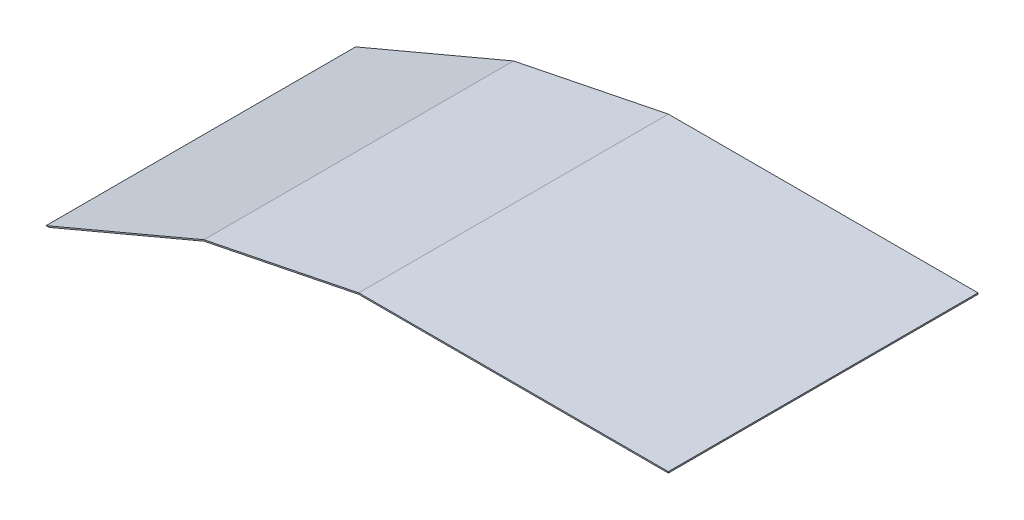
ISO-10303-21;
HEADER;
FILE_DESCRIPTION(('STEP AP214'),'2;1');
FILE_NAME('part.step','',(''),(''),'','','');
FILE_SCHEMA(('AUTOMOTIVE_DESIGN { 1 0 10303 214 1 1 1 1 }'));
ENDSEC;
DATA;
#1=APPLICATION_CONTEXT('core data for automotive mechanical design processes');
#2=APPLICATION_PROTOCOL_DEFINITION('international standard','automotive_design',2000,#1);
#3=PRODUCT_CONTEXT('',#1,'mechanical');
#4=PRODUCT('Part','Part','',(#3));
#5=PRODUCT_RELATED_PRODUCT_CATEGORY('part','',(#4));
#6=PRODUCT_DEFINITION_FORMATION('','',#4);
#7=PRODUCT_DEFINITION_CONTEXT('part definition',#1,'design');
#8=PRODUCT_DEFINITION('design','',#6,#7);
#9=PRODUCT_DEFINITION_SHAPE('','',#8);
#10=(LENGTH_UNIT() NAMED_UNIT(*) SI_UNIT(.MILLI.,.METRE.));
#11=(NAMED_UNIT(*) PLANE_ANGLE_UNIT() SI_UNIT($,.RADIAN.));
#12=(NAMED_UNIT(*) SI_UNIT($,.STERADIAN.) SOLID_ANGLE_UNIT());
#13=UNCERTAINTY_MEASURE_WITH_UNIT(LENGTH_MEASURE(1.E-05),#10,'distance_accuracy_value','');
#14=(GEOMETRIC_REPRESENTATION_CONTEXT(3) GLOBAL_UNCERTAINTY_ASSIGNED_CONTEXT((#13)) GLOBAL_UNIT_ASSIGNED_CONTEXT((#10,
#11,#12)) REPRESENTATION_CONTEXT('',''));
#15=CARTESIAN_POINT('',(0.,0.,0.));
#16=DIRECTION('',(0.,0.,1.));
#17=DIRECTION('',(1.,0.,0.));
#18=AXIS2_PLACEMENT_3D('',#15,#16,#17);
#19=CARTESIAN_POINT('',(-100.,31.6979559310791,100.));
#20=DIRECTION('',(0.,-1.,0.));
#21=DIRECTION('',(1.,0.,0.));
#22=AXIS2_PLACEMENT_3D('',#19,#20,#21);
#23=PLANE('',#22);
#24=DIRECTION('',(-1.,0.,0.));
#25=VECTOR('',#24,1.);
#26=CARTESIAN_POINT('',(-100.,31.6979559310791,0.));
#27=LINE('',#26,#25);
#28=CARTESIAN_POINT('',(0.,31.6979559310791,0.));
#29=VERTEX_POINT('',#28);
#30=CARTESIAN_POINT('',(-100.,31.6979559310791,0.));
#31=VERTEX_POINT('',#30);
#32=EDGE_CURVE('E140',#29,#31,#27,.T.);
#33=ORIENTED_EDGE('',*,*,#32,.T.);
#34=DIRECTION('',(0.,0.,-1.));
#35=VECTOR('',#34,1.);
#36=CARTESIAN_POINT('',(-100.,31.6979559310791,100.));
#37=LINE('',#36,#35);
#38=CARTESIAN_POINT('',(-100.,31.6979559310791,100.));
#39=VERTEX_POINT('',#38);
#40=EDGE_CURVE('E11',#39,#31,#37,.T.);
#41=ORIENTED_EDGE('',*,*,#40,.F.);
#42=DIRECTION('',(-1.,0.,0.));
#43=VECTOR('',#42,1.);
#44=CARTESIAN_POINT('',(-100.,31.6979559310791,100.));
#45=LINE('',#44,#43);
#46=CARTESIAN_POINT('',(0.,31.6979559310791,100.));
#47=VERTEX_POINT('',#46);
#48=EDGE_CURVE('E162',#47,#39,#45,.T.);
#49=ORIENTED_EDGE('',*,*,#48,.F.);
#50=DIRECTION('',(0.,0.,-1.));
#51=VECTOR('',#50,1.);
#52=CARTESIAN_POINT('',(0.,31.6979559310791,100.));
#53=LINE('',#52,#51);
#54=EDGE_CURVE('E136',#47,#29,#53,.T.);
#55=ORIENTED_EDGE('',*,*,#54,.T.);
#56=EDGE_LOOP('',(#33,#41,#49,#55));
#57=FACE_BOUND('',#56,.T.);
#58=ADVANCED_FACE('F39',(#57),#23,.F.);
#59=CARTESIAN_POINT('',(-150.,21.5624541556459,100.));
#60=DIRECTION('',(0.198669330795054,-0.980066577841243,0.));
#61=DIRECTION('',(0.980066577841243,0.198669330795054,0.));
#62=AXIS2_PLACEMENT_3D('',#59,#60,#61);
#63=PLANE('',#62);
#64=DIRECTION('',(-0.980066577841243,-0.198669330795054,0.));
#65=VECTOR('',#64,1.);
#66=CARTESIAN_POINT('',(-150.,21.5624541556459,0.));
#67=LINE('',#66,#65);
#68=CARTESIAN_POINT('',(-150.,21.5624541556459,0.));
#69=VERTEX_POINT('',#68);
#70=EDGE_CURVE('E144',#31,#69,#67,.T.);
#71=ORIENTED_EDGE('',*,*,#70,.T.);
#72=DIRECTION('',(0.,0.,-1.));
#73=VECTOR('',#72,1.);
#74=CARTESIAN_POINT('',(-150.,21.5624541556459,100.));
#75=LINE('',#74,#73);
#76=CARTESIAN_POINT('',(-150.,21.5624541556459,100.));
#77=VERTEX_POINT('',#76);
#78=EDGE_CURVE('E48',#77,#69,#75,.T.);
#79=ORIENTED_EDGE('',*,*,#78,.F.);
#80=DIRECTION('',(-0.980066577841243,-0.198669330795054,0.));
#81=VECTOR('',#80,1.);
#82=CARTESIAN_POINT('',(-150.,21.5624541556459,100.));
#83=LINE('',#82,#81);
#84=EDGE_CURVE('E99',#39,#77,#83,.T.);
#85=ORIENTED_EDGE('',*,*,#84,.F.);
#86=ORIENTED_EDGE('',*,*,#40,.T.);
#87=EDGE_LOOP('',(#71,#79,#85,#86));
#88=FACE_BOUND('',#87,.T.);
#89=ADVANCED_FACE('F208',(#88),#63,.F.);
#90=CARTESIAN_POINT('',(-201.,0.,100.));
#91=DIRECTION('',(0.389418342308644,-0.921060994002888,0.));
#92=DIRECTION('',(0.921060994002888,0.389418342308644,0.));
#93=AXIS2_PLACEMENT_3D('',#90,#91,#92);
#94=PLANE('',#93);
#95=DIRECTION('',(-0.921060994002888,-0.389418342308644,0.));
#96=VECTOR('',#95,1.);
#97=CARTESIAN_POINT('',(-201.,0.,0.));
#98=LINE('',#97,#96);
#99=CARTESIAN_POINT('',(-201.,0.,0.));
#100=VERTEX_POINT('',#99);
#101=EDGE_CURVE('E147',#69,#100,#98,.T.);
#102=ORIENTED_EDGE('',*,*,#101,.T.);
#103=DIRECTION('',(0.,0.,-1.));
#104=VECTOR('',#103,1.);
#105=CARTESIAN_POINT('',(-201.,0.,100.));
#106=LINE('',#105,#104);
#107=CARTESIAN_POINT('',(-201.,0.,100.));
#108=VERTEX_POINT('',#107);
#109=EDGE_CURVE('E173',#108,#100,#106,.T.);
#110=ORIENTED_EDGE('',*,*,#109,.F.);
#111=DIRECTION('',(-0.921060994002888,-0.389418342308644,0.));
#112=VECTOR('',#111,1.);
#113=CARTESIAN_POINT('',(-201.,0.,100.));
#114=LINE('',#113,#112);
#115=EDGE_CURVE('E183',#77,#108,#114,.T.);
#116=ORIENTED_EDGE('',*,*,#115,.F.);
#117=ORIENTED_EDGE('',*,*,#78,.T.);
#118=EDGE_LOOP('',(#102,#110,#116,#117));
#119=FACE_BOUND('',#118,.T.);
#120=ADVANCED_FACE('F181',(#119),#94,.F.);
#121=CARTESIAN_POINT('',(-200.,0.,100.));
#122=DIRECTION('',(0.,1.,0.));
#123=DIRECTION('',(-1.,0.,0.));
#124=AXIS2_PLACEMENT_3D('',#121,#122,#123);
#125=PLANE('',#124);
#126=DIRECTION('',(1.,0.,0.));
#127=VECTOR('',#126,1.);
#128=CARTESIAN_POINT('',(-200.,0.,0.));
#129=LINE('',#128,#127);
#130=CARTESIAN_POINT('',(-200.,0.,0.));
#131=VERTEX_POINT('',#130);
#132=EDGE_CURVE('E150',#100,#131,#129,.T.);
#133=ORIENTED_EDGE('',*,*,#132,.T.);
#134=DIRECTION('',(0.,0.,-1.));
#135=VECTOR('',#134,1.);
#136=CARTESIAN_POINT('',(-200.,0.,100.));
#137=LINE('',#136,#135);
#138=CARTESIAN_POINT('',(-200.,0.,100.));
#139=VERTEX_POINT('',#138);
#140=EDGE_CURVE('E169',#139,#131,#137,.T.);
#141=ORIENTED_EDGE('',*,*,#140,.F.);
#142=DIRECTION('',(1.,0.,0.));
#143=VECTOR('',#142,1.);
#144=CARTESIAN_POINT('',(-200.,0.,100.));
#145=LINE('',#144,#143);
#146=EDGE_CURVE('E196',#108,#139,#145,.T.);
#147=ORIENTED_EDGE('',*,*,#146,.F.);
#148=ORIENTED_EDGE('',*,*,#109,.T.);
#149=EDGE_LOOP('',(#133,#141,#147,#148));
#150=FACE_BOUND('',#149,.T.);
#151=ADVANCED_FACE('F191',(#150),#125,.F.);
#152=CARTESIAN_POINT('',(-200.,0.,100.));
#153=DIRECTION('',(-0.389418342308644,0.921060994002888,0.));
#154=DIRECTION('',(-0.921060994002888,-0.389418342308644,0.));
#155=AXIS2_PLACEMENT_3D('',#152,#153,#154);
#156=PLANE('',#155);
#157=DIRECTION('',(0.921060994002888,0.389418342308644,0.));
#158=VECTOR('',#157,1.);
#159=CARTESIAN_POINT('',(-200.,0.,0.));
#160=LINE('',#159,#158);
#161=CARTESIAN_POINT('',(-150.,21.1396609369077,0.));
#162=VERTEX_POINT('',#161);
#163=EDGE_CURVE('E153',#131,#162,#160,.T.);
#164=ORIENTED_EDGE('',*,*,#163,.T.);
#165=DIRECTION('',(0.,0.,-1.));
#166=VECTOR('',#165,1.);
#167=CARTESIAN_POINT('',(-150.,21.1396609369077,100.));
#168=LINE('',#167,#166);
#169=CARTESIAN_POINT('',(-150.,21.1396609369077,100.));
#170=VERTEX_POINT('',#169);
#171=EDGE_CURVE('E129',#170,#162,#168,.T.);
#172=ORIENTED_EDGE('',*,*,#171,.F.);
#173=DIRECTION('',(0.921060994002888,0.389418342308644,0.));
#174=VECTOR('',#173,1.);
#175=CARTESIAN_POINT('',(-200.,0.,100.));
#176=LINE('',#175,#174);
#177=EDGE_CURVE('E118',#139,#170,#176,.T.);
#178=ORIENTED_EDGE('',*,*,#177,.F.);
#179=ORIENTED_EDGE('',*,*,#140,.T.);
#180=EDGE_LOOP('',(#164,#172,#178,#179));
#181=FACE_BOUND('',#180,.T.);
#182=ADVANCED_FACE('F194',(#181),#156,.F.);
#183=CARTESIAN_POINT('',(-150.,21.1396609369077,100.));
#184=DIRECTION('',(-0.198669330795054,0.980066577841243,0.));
#185=DIRECTION('',(-0.980066577841243,-0.198669330795054,0.));
#186=AXIS2_PLACEMENT_3D('',#183,#184,#185);
#187=PLANE('',#186);
#188=DIRECTION('',(0.980066577841243,0.198669330795054,0.));
#189=VECTOR('',#188,1.);
#190=CARTESIAN_POINT('',(-150.,21.1396609369077,0.));
#191=LINE('',#190,#189);
#192=CARTESIAN_POINT('',(-100.,31.275162712341,0.));
#193=VERTEX_POINT('',#192);
#194=EDGE_CURVE('E127',#162,#193,#191,.T.);
#195=ORIENTED_EDGE('',*,*,#194,.T.);
#196=DIRECTION('',(0.,0.,-1.));
#197=VECTOR('',#196,1.);
#198=CARTESIAN_POINT('',(-100.,31.275162712341,100.));
#199=LINE('',#198,#197);
#200=CARTESIAN_POINT('',(-100.,31.275162712341,100.));
#201=VERTEX_POINT('',#200);
#202=EDGE_CURVE('E124',#201,#193,#199,.T.);
#203=ORIENTED_EDGE('',*,*,#202,.F.);
#204=DIRECTION('',(0.980066577841243,0.198669330795054,0.));
#205=VECTOR('',#204,1.);
#206=CARTESIAN_POINT('',(-150.,21.1396609369077,100.));
#207=LINE('',#206,#205);
#208=EDGE_CURVE('E112',#170,#201,#207,.T.);
#209=ORIENTED_EDGE('',*,*,#208,.F.);
#210=ORIENTED_EDGE('',*,*,#171,.T.);
#211=EDGE_LOOP('',(#195,#203,#209,#210));
#212=FACE_BOUND('',#211,.T.);
#213=ADVANCED_FACE('F125',(#212),#187,.F.);
#214=CARTESIAN_POINT('',(-100.,31.275162712341,100.));
#215=DIRECTION('',(0.,1.,0.));
#216=DIRECTION('',(-1.,0.,0.));
#217=AXIS2_PLACEMENT_3D('',#214,#215,#216);
#218=PLANE('',#217);
#219=DIRECTION('',(1.,0.,0.));
#220=VECTOR('',#219,1.);
#221=CARTESIAN_POINT('',(-100.,31.275162712341,0.));
#222=LINE('',#221,#220);
#223=CARTESIAN_POINT('',(0.,31.275162712341,0.));
#224=VERTEX_POINT('',#223);
#225=EDGE_CURVE('E85',#193,#224,#222,.T.);
#226=ORIENTED_EDGE('',*,*,#225,.T.);
#227=DIRECTION('',(0.,0.,-1.));
#228=VECTOR('',#227,1.);
#229=CARTESIAN_POINT('',(0.,31.275162712341,100.));
#230=LINE('',#229,#228);
#231=CARTESIAN_POINT('',(0.,31.275162712341,100.));
#232=VERTEX_POINT('',#231);
#233=EDGE_CURVE('E130',#232,#224,#230,.T.);
#234=ORIENTED_EDGE('',*,*,#233,.F.);
#235=DIRECTION('',(1.,0.,0.));
#236=VECTOR('',#235,1.);
#237=CARTESIAN_POINT('',(-100.,31.275162712341,100.));
#238=LINE('',#237,#236);
#239=EDGE_CURVE('E116',#201,#232,#238,.T.);
#240=ORIENTED_EDGE('',*,*,#239,.F.);
#241=ORIENTED_EDGE('',*,*,#202,.T.);
#242=EDGE_LOOP('',(#226,#234,#240,#241));
#243=FACE_BOUND('',#242,.T.);
#244=ADVANCED_FACE('F132',(#243),#218,.F.);
#245=CARTESIAN_POINT('',(0.,31.6979559310791,100.));
#246=DIRECTION('',(-1.,0.,0.));
#247=DIRECTION('',(0.,0.,1.));
#248=AXIS2_PLACEMENT_3D('',#245,#246,#247);
#249=PLANE('',#248);
#250=DIRECTION('',(0.,1.,0.));
#251=VECTOR('',#250,1.);
#252=CARTESIAN_POINT('',(0.,31.6979559310791,0.));
#253=LINE('',#252,#251);
#254=EDGE_CURVE('E91',#224,#29,#253,.T.);
#255=ORIENTED_EDGE('',*,*,#254,.T.);
#256=ORIENTED_EDGE('',*,*,#54,.F.);
#257=DIRECTION('',(0.,1.,0.));
#258=VECTOR('',#257,1.);
#259=CARTESIAN_POINT('',(0.,31.6979559310791,100.));
#260=LINE('',#259,#258);
#261=EDGE_CURVE('E56',#232,#47,#260,.T.);
#262=ORIENTED_EDGE('',*,*,#261,.F.);
#263=ORIENTED_EDGE('',*,*,#233,.T.);
#264=EDGE_LOOP('',(#255,#256,#262,#263));
#265=FACE_BOUND('',#264,.T.);
#266=ADVANCED_FACE('F224',(#265),#249,.F.);
#267=CARTESIAN_POINT('',(0.,0.,100.));
#268=DIRECTION('',(0.,0.,-1.));
#269=DIRECTION('',(-1.,0.,0.));
#270=AXIS2_PLACEMENT_3D('',#267,#268,#269);
#271=PLANE('',#270);
#272=ORIENTED_EDGE('',*,*,#48,.T.);
#273=ORIENTED_EDGE('',*,*,#84,.T.);
#274=ORIENTED_EDGE('',*,*,#115,.T.);
#275=ORIENTED_EDGE('',*,*,#146,.T.);
#276=ORIENTED_EDGE('',*,*,#177,.T.);
#277=ORIENTED_EDGE('',*,*,#208,.T.);
#278=ORIENTED_EDGE('',*,*,#239,.T.);
#279=ORIENTED_EDGE('',*,*,#261,.T.);
#280=EDGE_LOOP('',(#272,#273,#274,#275,#276,#277,#278,#279));
#281=FACE_BOUND('',#280,.T.);
#282=ADVANCED_FACE('F114',(#281),#271,.F.);
#283=CARTESIAN_POINT('',(0.,0.,0.));
#284=DIRECTION('',(0.,0.,-1.));
#285=DIRECTION('',(-1.,0.,0.));
#286=AXIS2_PLACEMENT_3D('',#283,#284,#285);
#287=PLANE('',#286);
#288=ORIENTED_EDGE('',*,*,#32,.F.);
#289=ORIENTED_EDGE('',*,*,#254,.F.);
#290=ORIENTED_EDGE('',*,*,#225,.F.);
#291=ORIENTED_EDGE('',*,*,#194,.F.);
#292=ORIENTED_EDGE('',*,*,#163,.F.);
#293=ORIENTED_EDGE('',*,*,#132,.F.);
#294=ORIENTED_EDGE('',*,*,#101,.F.);
#295=ORIENTED_EDGE('',*,*,#70,.F.);
#296=EDGE_LOOP('',(#288,#289,#290,#291,#292,#293,#294,#295));
#297=FACE_BOUND('',#296,.T.);
#298=ADVANCED_FACE('F187',(#297),#287,.T.);
#299=CLOSED_SHELL('',(#58,#89,#120,#151,#182,#213,#244,#266,#282,#298));
#300=MANIFOLD_SOLID_BREP('B2',#299);
#301=ADVANCED_BREP_SHAPE_REPRESENTATION('',(#18,#300),#14);
#302=SHAPE_DEFINITION_REPRESENTATION(#9,#301);
ENDSEC;
END-ISO-10303-21;
